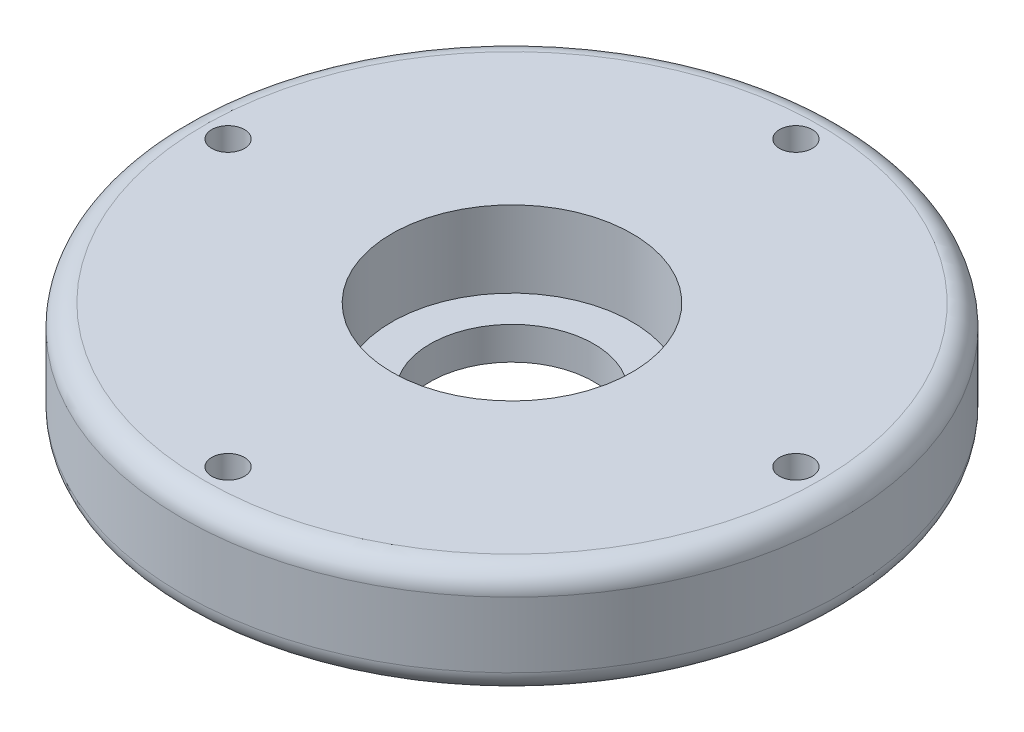
ISO-10303-21;
HEADER;
FILE_DESCRIPTION(('STEP AP214'),'2;1');
FILE_NAME('part.step','',(''),(''),'','','');
FILE_SCHEMA(('AUTOMOTIVE_DESIGN { 1 0 10303 214 1 1 1 1 }'));
ENDSEC;
DATA;
#1=APPLICATION_CONTEXT('core data for automotive mechanical design processes');
#2=APPLICATION_PROTOCOL_DEFINITION('international standard','automotive_design',2000,#1);
#3=PRODUCT_CONTEXT('',#1,'mechanical');
#4=PRODUCT('Part','Part','',(#3));
#5=PRODUCT_RELATED_PRODUCT_CATEGORY('part','',(#4));
#6=PRODUCT_DEFINITION_FORMATION('','',#4);
#7=PRODUCT_DEFINITION_CONTEXT('part definition',#1,'design');
#8=PRODUCT_DEFINITION('design','',#6,#7);
#9=PRODUCT_DEFINITION_SHAPE('','',#8);
#10=(LENGTH_UNIT() NAMED_UNIT(*) SI_UNIT(.MILLI.,.METRE.));
#11=(NAMED_UNIT(*) PLANE_ANGLE_UNIT() SI_UNIT($,.RADIAN.));
#12=(NAMED_UNIT(*) SI_UNIT($,.STERADIAN.) SOLID_ANGLE_UNIT());
#13=UNCERTAINTY_MEASURE_WITH_UNIT(LENGTH_MEASURE(1.E-05),#10,'distance_accuracy_value','');
#14=(GEOMETRIC_REPRESENTATION_CONTEXT(3) GLOBAL_UNCERTAINTY_ASSIGNED_CONTEXT((#13)) GLOBAL_UNIT_ASSIGNED_CONTEXT((#10,
#11,#12)) REPRESENTATION_CONTEXT('',''));
#15=CARTESIAN_POINT('',(0.,0.,0.));
#16=DIRECTION('',(0.,0.,1.));
#17=DIRECTION('',(1.,0.,0.));
#18=AXIS2_PLACEMENT_3D('',#15,#16,#17);
#19=CARTESIAN_POINT('',(0.,10.,0.));
#20=DIRECTION('',(0.,-1.,0.));
#21=DIRECTION('',(0.,0.,-1.));
#22=AXIS2_PLACEMENT_3D('',#19,#20,#21);
#23=CYLINDRICAL_SURFACE('',#22,7.5);
#24=CARTESIAN_POINT('',(0.,0.,0.));
#25=DIRECTION('',(0.,1.,0.));
#26=DIRECTION('',(0.,0.,1.));
#27=AXIS2_PLACEMENT_3D('',#24,#25,#26);
#28=CIRCLE('',#27,7.5);
#29=CARTESIAN_POINT('',(0.,0.,7.5));
#30=VERTEX_POINT('',#29);
#31=EDGE_CURVE('E67',#30,#30,#28,.T.);
#32=ORIENTED_EDGE('',*,*,#31,.F.);
#33=EDGE_LOOP('',(#32));
#34=FACE_BOUND('',#33,.T.);
#35=CARTESIAN_POINT('',(0.,3.,0.));
#36=DIRECTION('',(0.,1.,0.));
#37=DIRECTION('',(0.,0.,1.));
#38=AXIS2_PLACEMENT_3D('',#35,#36,#37);
#39=CIRCLE('',#38,7.5);
#40=CARTESIAN_POINT('',(0.,3.,7.5));
#41=VERTEX_POINT('',#40);
#42=EDGE_CURVE('E68',#41,#41,#39,.T.);
#43=ORIENTED_EDGE('',*,*,#42,.T.);
#44=EDGE_LOOP('',(#43));
#45=FACE_BOUND('',#44,.T.);
#46=ADVANCED_FACE('F43',(#34,#45),#23,.F.);
#47=CARTESIAN_POINT('',(0.,10.,0.));
#48=DIRECTION('',(0.,1.,0.));
#49=DIRECTION('',(0.,0.,1.));
#50=AXIS2_PLACEMENT_3D('',#47,#48,#49);
#51=PLANE('',#50);
#52=CARTESIAN_POINT('',(0.,10.,0.));
#53=DIRECTION('',(0.,1.,0.));
#54=DIRECTION('',(0.,0.,1.));
#55=AXIS2_PLACEMENT_3D('',#52,#53,#54);
#56=CIRCLE('',#55,28.18);
#57=CARTESIAN_POINT('',(0.,10.,28.18));
#58=VERTEX_POINT('',#57);
#59=EDGE_CURVE('E10',#58,#58,#56,.T.);
#60=ORIENTED_EDGE('',*,*,#59,.T.);
#61=EDGE_LOOP('',(#60));
#62=FACE_BOUND('',#61,.T.);
#63=CARTESIAN_POINT('',(0.,10.,0.));
#64=DIRECTION('',(0.,1.,0.));
#65=DIRECTION('',(0.,0.,1.));
#66=AXIS2_PLACEMENT_3D('',#63,#64,#65);
#67=CIRCLE('',#66,11.);
#68=CARTESIAN_POINT('',(0.,10.,11.));
#69=VERTEX_POINT('',#68);
#70=EDGE_CURVE('E108',#69,#69,#67,.T.);
#71=ORIENTED_EDGE('',*,*,#70,.F.);
#72=EDGE_LOOP('',(#71));
#73=FACE_BOUND('',#72,.T.);
#74=CARTESIAN_POINT('',(0.,10.,-26.));
#75=DIRECTION('',(0.,1.,0.));
#76=DIRECTION('',(0.,0.,1.));
#77=AXIS2_PLACEMENT_3D('',#74,#75,#76);
#78=CIRCLE('',#77,1.5);
#79=CARTESIAN_POINT('',(0.,10.,-24.5));
#80=VERTEX_POINT('',#79);
#81=EDGE_CURVE('E101',#80,#80,#78,.T.);
#82=ORIENTED_EDGE('',*,*,#81,.F.);
#83=EDGE_LOOP('',(#82));
#84=FACE_BOUND('',#83,.T.);
#85=CARTESIAN_POINT('',(26.,10.,0.));
#86=DIRECTION('',(0.,1.,0.));
#87=DIRECTION('',(0.,0.,1.));
#88=AXIS2_PLACEMENT_3D('',#85,#86,#87);
#89=CIRCLE('',#88,1.5);
#90=CARTESIAN_POINT('',(26.,10.,1.5));
#91=VERTEX_POINT('',#90);
#92=EDGE_CURVE('E97',#91,#91,#89,.T.);
#93=ORIENTED_EDGE('',*,*,#92,.F.);
#94=EDGE_LOOP('',(#93));
#95=FACE_BOUND('',#94,.T.);
#96=CARTESIAN_POINT('',(-26.,10.,0.));
#97=DIRECTION('',(0.,1.,0.));
#98=DIRECTION('',(0.,0.,1.));
#99=AXIS2_PLACEMENT_3D('',#96,#97,#98);
#100=CIRCLE('',#99,1.5);
#101=CARTESIAN_POINT('',(-26.,10.,1.5));
#102=VERTEX_POINT('',#101);
#103=EDGE_CURVE('E89',#102,#102,#100,.T.);
#104=ORIENTED_EDGE('',*,*,#103,.F.);
#105=EDGE_LOOP('',(#104));
#106=FACE_BOUND('',#105,.T.);
#107=CARTESIAN_POINT('',(0.,10.,26.));
#108=DIRECTION('',(0.,1.,0.));
#109=DIRECTION('',(0.,0.,1.));
#110=AXIS2_PLACEMENT_3D('',#107,#108,#109);
#111=CIRCLE('',#110,1.5);
#112=CARTESIAN_POINT('',(0.,10.,27.5));
#113=VERTEX_POINT('',#112);
#114=EDGE_CURVE('E81',#113,#113,#111,.T.);
#115=ORIENTED_EDGE('',*,*,#114,.F.);
#116=EDGE_LOOP('',(#115));
#117=FACE_BOUND('',#116,.T.);
#118=ADVANCED_FACE('F125',(#62,#73,#84,#95,#106,#117),#51,.T.);
#119=CARTESIAN_POINT('',(0.,0.,0.));
#120=DIRECTION('',(0.,1.,0.));
#121=DIRECTION('',(0.,0.,1.));
#122=AXIS2_PLACEMENT_3D('',#119,#120,#121);
#123=PLANE('',#122);
#124=CARTESIAN_POINT('',(0.,0.,0.));
#125=DIRECTION('',(0.,1.,0.));
#126=DIRECTION('',(0.,0.,1.));
#127=AXIS2_PLACEMENT_3D('',#124,#125,#126);
#128=CIRCLE('',#127,28.18);
#129=CARTESIAN_POINT('',(0.,0.,28.18));
#130=VERTEX_POINT('',#129);
#131=EDGE_CURVE('E51',#130,#130,#128,.F.);
#132=ORIENTED_EDGE('',*,*,#131,.T.);
#133=EDGE_LOOP('',(#132));
#134=FACE_BOUND('',#133,.T.);
#135=CARTESIAN_POINT('',(0.,0.,-26.));
#136=DIRECTION('',(0.,1.,0.));
#137=DIRECTION('',(0.,0.,1.));
#138=AXIS2_PLACEMENT_3D('',#135,#136,#137);
#139=CIRCLE('',#138,1.5);
#140=CARTESIAN_POINT('',(0.,0.,-24.5));
#141=VERTEX_POINT('',#140);
#142=EDGE_CURVE('E77',#141,#141,#139,.T.);
#143=ORIENTED_EDGE('',*,*,#142,.T.);
#144=EDGE_LOOP('',(#143));
#145=FACE_BOUND('',#144,.T.);
#146=CARTESIAN_POINT('',(26.,0.,0.));
#147=DIRECTION('',(0.,1.,0.));
#148=DIRECTION('',(0.,0.,1.));
#149=AXIS2_PLACEMENT_3D('',#146,#147,#148);
#150=CIRCLE('',#149,1.5);
#151=CARTESIAN_POINT('',(26.,0.,1.5));
#152=VERTEX_POINT('',#151);
#153=EDGE_CURVE('E93',#152,#152,#150,.T.);
#154=ORIENTED_EDGE('',*,*,#153,.T.);
#155=EDGE_LOOP('',(#154));
#156=FACE_BOUND('',#155,.T.);
#157=CARTESIAN_POINT('',(-26.,0.,0.));
#158=DIRECTION('',(0.,1.,0.));
#159=DIRECTION('',(0.,0.,1.));
#160=AXIS2_PLACEMENT_3D('',#157,#158,#159);
#161=CIRCLE('',#160,1.5);
#162=CARTESIAN_POINT('',(-26.,0.,1.5));
#163=VERTEX_POINT('',#162);
#164=EDGE_CURVE('E85',#163,#163,#161,.T.);
#165=ORIENTED_EDGE('',*,*,#164,.T.);
#166=EDGE_LOOP('',(#165));
#167=FACE_BOUND('',#166,.T.);
#168=CARTESIAN_POINT('',(0.,0.,26.));
#169=DIRECTION('',(0.,1.,0.));
#170=DIRECTION('',(0.,0.,1.));
#171=AXIS2_PLACEMENT_3D('',#168,#169,#170);
#172=CIRCLE('',#171,1.5);
#173=CARTESIAN_POINT('',(0.,0.,27.5));
#174=VERTEX_POINT('',#173);
#175=EDGE_CURVE('E72',#174,#174,#172,.T.);
#176=ORIENTED_EDGE('',*,*,#175,.T.);
#177=EDGE_LOOP('',(#176));
#178=FACE_BOUND('',#177,.T.);
#179=ORIENTED_EDGE('',*,*,#31,.T.);
#180=EDGE_LOOP('',(#179));
#181=FACE_BOUND('',#180,.T.);
#182=ADVANCED_FACE('F128',(#134,#145,#156,#167,#178,#181),#123,.F.);
#183=CARTESIAN_POINT('',(0.,10.,0.));
#184=DIRECTION('',(0.,-1.,0.));
#185=DIRECTION('',(0.,0.,-1.));
#186=AXIS2_PLACEMENT_3D('',#183,#184,#185);
#187=CYLINDRICAL_SURFACE('',#186,30.18);
#188=CARTESIAN_POINT('',(0.,2.,0.));
#189=DIRECTION('',(0.,1.,0.));
#190=DIRECTION('',(0.,0.,1.));
#191=AXIS2_PLACEMENT_3D('',#188,#189,#190);
#192=CIRCLE('',#191,30.18);
#193=CARTESIAN_POINT('',(0.,2.,30.18));
#194=VERTEX_POINT('',#193);
#195=EDGE_CURVE('E56',#194,#194,#192,.T.);
#196=ORIENTED_EDGE('',*,*,#195,.T.);
#197=EDGE_LOOP('',(#196));
#198=FACE_BOUND('',#197,.T.);
#199=CARTESIAN_POINT('',(0.,8.,0.));
#200=DIRECTION('',(0.,1.,0.));
#201=DIRECTION('',(0.,0.,1.));
#202=AXIS2_PLACEMENT_3D('',#199,#200,#201);
#203=CIRCLE('',#202,30.18);
#204=CARTESIAN_POINT('',(0.,8.,30.18));
#205=VERTEX_POINT('',#204);
#206=EDGE_CURVE('E61',#205,#205,#203,.F.);
#207=ORIENTED_EDGE('',*,*,#206,.T.);
#208=EDGE_LOOP('',(#207));
#209=FACE_BOUND('',#208,.T.);
#210=ADVANCED_FACE('F141',(#198,#209),#187,.T.);
#211=CARTESIAN_POINT('',(0.,0.,26.));
#212=DIRECTION('',(0.,1.,0.));
#213=DIRECTION('',(0.,0.,1.));
#214=AXIS2_PLACEMENT_3D('',#211,#212,#213);
#215=CYLINDRICAL_SURFACE('',#214,1.5);
#216=ORIENTED_EDGE('',*,*,#175,.F.);
#217=EDGE_LOOP('',(#216));
#218=FACE_BOUND('',#217,.T.);
#219=ORIENTED_EDGE('',*,*,#114,.T.);
#220=EDGE_LOOP('',(#219));
#221=FACE_BOUND('',#220,.T.);
#222=ADVANCED_FACE('F138',(#218,#221),#215,.F.);
#223=CARTESIAN_POINT('',(-26.,0.,0.));
#224=DIRECTION('',(0.,1.,0.));
#225=DIRECTION('',(0.,0.,1.));
#226=AXIS2_PLACEMENT_3D('',#223,#224,#225);
#227=CYLINDRICAL_SURFACE('',#226,1.5);
#228=ORIENTED_EDGE('',*,*,#164,.F.);
#229=EDGE_LOOP('',(#228));
#230=FACE_BOUND('',#229,.T.);
#231=ORIENTED_EDGE('',*,*,#103,.T.);
#232=EDGE_LOOP('',(#231));
#233=FACE_BOUND('',#232,.T.);
#234=ADVANCED_FACE('F140',(#230,#233),#227,.F.);
#235=CARTESIAN_POINT('',(26.,0.,0.));
#236=DIRECTION('',(0.,1.,0.));
#237=DIRECTION('',(0.,0.,1.));
#238=AXIS2_PLACEMENT_3D('',#235,#236,#237);
#239=CYLINDRICAL_SURFACE('',#238,1.5);
#240=ORIENTED_EDGE('',*,*,#153,.F.);
#241=EDGE_LOOP('',(#240));
#242=FACE_BOUND('',#241,.T.);
#243=ORIENTED_EDGE('',*,*,#92,.T.);
#244=EDGE_LOOP('',(#243));
#245=FACE_BOUND('',#244,.T.);
#246=ADVANCED_FACE('F147',(#242,#245),#239,.F.);
#247=CARTESIAN_POINT('',(0.,0.,-26.));
#248=DIRECTION('',(0.,1.,0.));
#249=DIRECTION('',(0.,0.,1.));
#250=AXIS2_PLACEMENT_3D('',#247,#248,#249);
#251=CYLINDRICAL_SURFACE('',#250,1.5);
#252=ORIENTED_EDGE('',*,*,#142,.F.);
#253=EDGE_LOOP('',(#252));
#254=FACE_BOUND('',#253,.T.);
#255=ORIENTED_EDGE('',*,*,#81,.T.);
#256=EDGE_LOOP('',(#255));
#257=FACE_BOUND('',#256,.T.);
#258=ADVANCED_FACE('F121',(#254,#257),#251,.F.);
#259=CARTESIAN_POINT('',(0.,3.,0.));
#260=DIRECTION('',(0.,1.,0.));
#261=DIRECTION('',(0.,0.,1.));
#262=AXIS2_PLACEMENT_3D('',#259,#260,#261);
#263=CYLINDRICAL_SURFACE('',#262,11.);
#264=CARTESIAN_POINT('',(0.,3.,0.));
#265=DIRECTION('',(0.,1.,0.));
#266=DIRECTION('',(0.,0.,1.));
#267=AXIS2_PLACEMENT_3D('',#264,#265,#266);
#268=CIRCLE('',#267,11.);
#269=CARTESIAN_POINT('',(0.,3.,11.));
#270=VERTEX_POINT('',#269);
#271=EDGE_CURVE('E73',#270,#270,#268,.T.);
#272=ORIENTED_EDGE('',*,*,#271,.F.);
#273=EDGE_LOOP('',(#272));
#274=FACE_BOUND('',#273,.T.);
#275=ORIENTED_EDGE('',*,*,#70,.T.);
#276=EDGE_LOOP('',(#275));
#277=FACE_BOUND('',#276,.T.);
#278=ADVANCED_FACE('F118',(#274,#277),#263,.F.);
#279=CARTESIAN_POINT('',(0.,3.,0.));
#280=DIRECTION('',(0.,1.,0.));
#281=DIRECTION('',(0.,0.,1.));
#282=AXIS2_PLACEMENT_3D('',#279,#280,#281);
#283=PLANE('',#282);
#284=ORIENTED_EDGE('',*,*,#42,.F.);
#285=EDGE_LOOP('',(#284));
#286=FACE_BOUND('',#285,.T.);
#287=ORIENTED_EDGE('',*,*,#271,.T.);
#288=EDGE_LOOP('',(#287));
#289=FACE_BOUND('',#288,.T.);
#290=ADVANCED_FACE('F116',(#286,#289),#283,.T.);
#291=CARTESIAN_POINT('',(0.,2.,0.));
#292=DIRECTION('',(0.,1.,0.));
#293=DIRECTION('',(0.,0.,1.));
#294=AXIS2_PLACEMENT_3D('',#291,#292,#293);
#295=TOROIDAL_SURFACE('',#294,28.18,2.);
#296=ORIENTED_EDGE('',*,*,#131,.F.);
#297=EDGE_LOOP('',(#296));
#298=FACE_BOUND('',#297,.T.);
#299=ORIENTED_EDGE('',*,*,#195,.F.);
#300=EDGE_LOOP('',(#299));
#301=FACE_BOUND('',#300,.T.);
#302=ADVANCED_FACE('F164',(#298,#301),#295,.T.);
#303=CARTESIAN_POINT('',(0.,8.,0.));
#304=DIRECTION('',(0.,1.,0.));
#305=DIRECTION('',(0.,0.,1.));
#306=AXIS2_PLACEMENT_3D('',#303,#304,#305);
#307=TOROIDAL_SURFACE('',#306,28.18,2.);
#308=ORIENTED_EDGE('',*,*,#206,.F.);
#309=EDGE_LOOP('',(#308));
#310=FACE_BOUND('',#309,.T.);
#311=ORIENTED_EDGE('',*,*,#59,.F.);
#312=EDGE_LOOP('',(#311));
#313=FACE_BOUND('',#312,.T.);
#314=ADVANCED_FACE('F45',(#310,#313),#307,.T.);
#315=CLOSED_SHELL('',(#46,#118,#182,#210,#222,#234,#246,#258,#278,#290,#302,#314));
#316=MANIFOLD_SOLID_BREP('B2',#315);
#317=ADVANCED_BREP_SHAPE_REPRESENTATION('',(#18,#316),#14);
#318=SHAPE_DEFINITION_REPRESENTATION(#9,#317);
ENDSEC;
END-ISO-10303-21;
